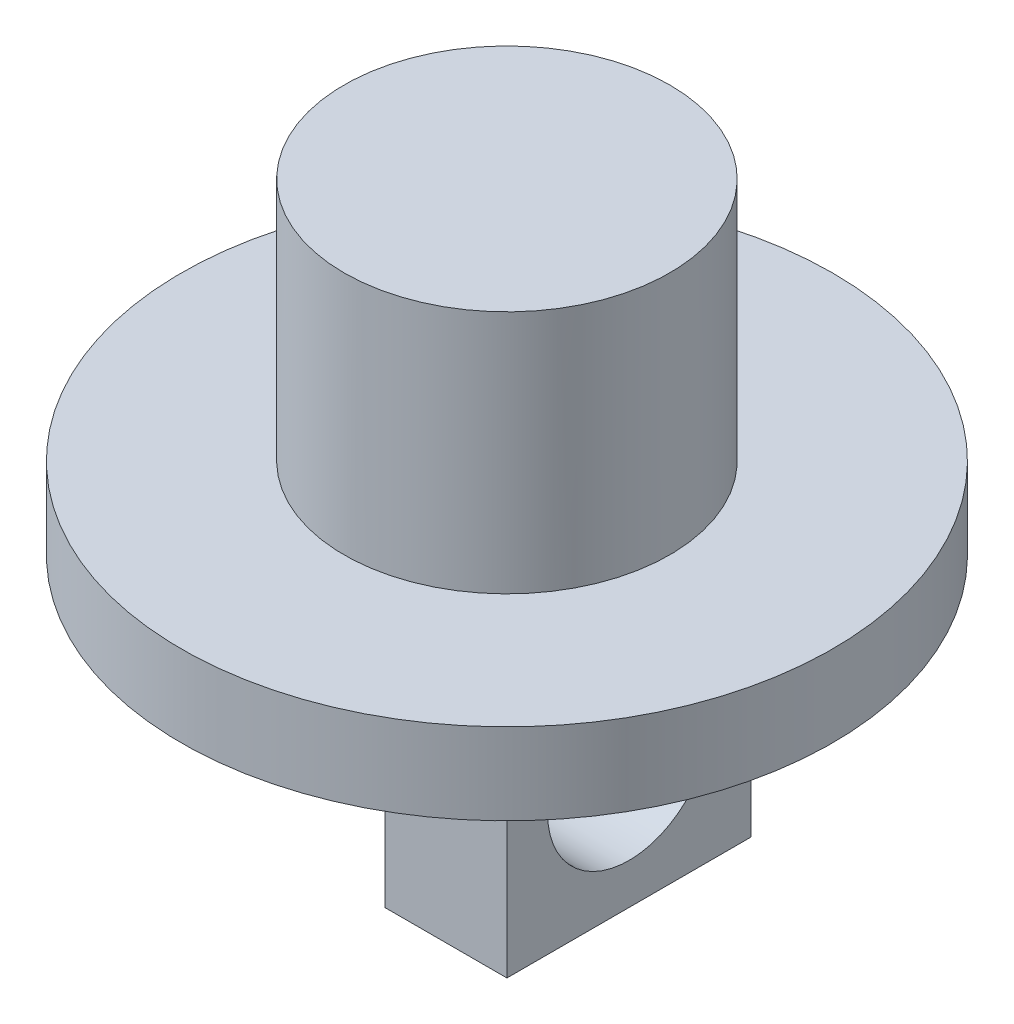
ISO-10303-21;
HEADER;
FILE_DESCRIPTION(('STEP AP214'),'2;1');
FILE_NAME('part.step','',(''),(''),'','','');
FILE_SCHEMA(('AUTOMOTIVE_DESIGN { 1 0 10303 214 1 1 1 1 }'));
ENDSEC;
DATA;
#1=APPLICATION_CONTEXT('core data for automotive mechanical design processes');
#2=APPLICATION_PROTOCOL_DEFINITION('international standard','automotive_design',2000,#1);
#3=PRODUCT_CONTEXT('',#1,'mechanical');
#4=PRODUCT('Part','Part','',(#3));
#5=PRODUCT_RELATED_PRODUCT_CATEGORY('part','',(#4));
#6=PRODUCT_DEFINITION_FORMATION('','',#4);
#7=PRODUCT_DEFINITION_CONTEXT('part definition',#1,'design');
#8=PRODUCT_DEFINITION('design','',#6,#7);
#9=PRODUCT_DEFINITION_SHAPE('','',#8);
#10=(LENGTH_UNIT() NAMED_UNIT(*) SI_UNIT(.MILLI.,.METRE.));
#11=(NAMED_UNIT(*) PLANE_ANGLE_UNIT() SI_UNIT($,.RADIAN.));
#12=(NAMED_UNIT(*) SI_UNIT($,.STERADIAN.) SOLID_ANGLE_UNIT());
#13=UNCERTAINTY_MEASURE_WITH_UNIT(LENGTH_MEASURE(1.E-05),#10,'distance_accuracy_value','');
#14=(GEOMETRIC_REPRESENTATION_CONTEXT(3) GLOBAL_UNCERTAINTY_ASSIGNED_CONTEXT((#13)) GLOBAL_UNIT_ASSIGNED_CONTEXT((#10,
#11,#12)) REPRESENTATION_CONTEXT('',''));
#15=CARTESIAN_POINT('',(0.,0.,0.));
#16=DIRECTION('',(0.,0.,1.));
#17=DIRECTION('',(1.,0.,0.));
#18=AXIS2_PLACEMENT_3D('',#15,#16,#17);
#19=CARTESIAN_POINT('',(0.,0.,0.));
#20=DIRECTION('',(0.,1.,0.));
#21=DIRECTION('',(0.,0.,1.));
#22=AXIS2_PLACEMENT_3D('',#19,#20,#21);
#23=PLANE('',#22);
#24=CARTESIAN_POINT('',(0.,0.,0.));
#25=DIRECTION('',(0.,-1.,0.));
#26=DIRECTION('',(0.,0.,-1.));
#27=AXIS2_PLACEMENT_3D('',#24,#25,#26);
#28=CIRCLE('',#27,5.08);
#29=CARTESIAN_POINT('',(0.,0.,-5.08));
#30=VERTEX_POINT('',#29);
#31=EDGE_CURVE('E104',#30,#30,#28,.T.);
#32=ORIENTED_EDGE('',*,*,#31,.T.);
#33=EDGE_LOOP('',(#32));
#34=FACE_BOUND('',#33,.T.);
#35=DIRECTION('',(0.,0.,-1.));
#36=VECTOR('',#35,1.);
#37=CARTESIAN_POINT('',(0.,0.,1.905));
#38=LINE('',#37,#36);
#39=CARTESIAN_POINT('',(0.,0.,1.905));
#40=VERTEX_POINT('',#39);
#41=CARTESIAN_POINT('',(0.,0.,-1.905));
#42=VERTEX_POINT('',#41);
#43=EDGE_CURVE('E55',#40,#42,#38,.T.);
#44=ORIENTED_EDGE('',*,*,#43,.F.);
#45=DIRECTION('',(-1.,0.,0.));
#46=VECTOR('',#45,1.);
#47=CARTESIAN_POINT('',(0.,0.,1.905));
#48=LINE('',#47,#46);
#49=CARTESIAN_POINT('',(1.905,0.,1.905));
#50=VERTEX_POINT('',#49);
#51=EDGE_CURVE('E59',#50,#40,#48,.T.);
#52=ORIENTED_EDGE('',*,*,#51,.F.);
#53=DIRECTION('',(0.,0.,1.));
#54=VECTOR('',#53,1.);
#55=CARTESIAN_POINT('',(1.905,0.,1.905));
#56=LINE('',#55,#54);
#57=CARTESIAN_POINT('',(1.905,0.,-1.905));
#58=VERTEX_POINT('',#57);
#59=EDGE_CURVE('E189',#58,#50,#56,.T.);
#60=ORIENTED_EDGE('',*,*,#59,.F.);
#61=DIRECTION('',(1.,0.,0.));
#62=VECTOR('',#61,1.);
#63=CARTESIAN_POINT('',(0.,0.,-1.905));
#64=LINE('',#63,#62);
#65=EDGE_CURVE('E178',#42,#58,#64,.T.);
#66=ORIENTED_EDGE('',*,*,#65,.F.);
#67=EDGE_LOOP('',(#44,#52,#60,#66));
#68=FACE_BOUND('',#67,.T.);
#69=ADVANCED_FACE('F39',(#34,#68),#23,.F.);
#70=CARTESIAN_POINT('',(0.,5.08,0.));
#71=DIRECTION('',(0.,-1.,0.));
#72=DIRECTION('',(0.,0.,-1.));
#73=AXIS2_PLACEMENT_3D('',#70,#71,#72);
#74=CYLINDRICAL_SURFACE('',#73,2.54);
#75=CARTESIAN_POINT('',(0.,5.08,0.));
#76=DIRECTION('',(0.,1.,0.));
#77=DIRECTION('',(0.,0.,1.));
#78=AXIS2_PLACEMENT_3D('',#75,#76,#77);
#79=CIRCLE('',#78,2.54);
#80=CARTESIAN_POINT('',(0.,5.08,2.54));
#81=VERTEX_POINT('',#80);
#82=EDGE_CURVE('E48',#81,#81,#79,.T.);
#83=ORIENTED_EDGE('',*,*,#82,.F.);
#84=EDGE_LOOP('',(#83));
#85=FACE_BOUND('',#84,.T.);
#86=CARTESIAN_POINT('',(0.,1.27,0.));
#87=DIRECTION('',(0.,-1.,0.));
#88=DIRECTION('',(0.,0.,-1.));
#89=AXIS2_PLACEMENT_3D('',#86,#87,#88);
#90=CIRCLE('',#89,2.54);
#91=CARTESIAN_POINT('',(0.,1.27,-2.54));
#92=VERTEX_POINT('',#91);
#93=EDGE_CURVE('E11',#92,#92,#90,.T.);
#94=ORIENTED_EDGE('',*,*,#93,.F.);
#95=EDGE_LOOP('',(#94));
#96=FACE_BOUND('',#95,.T.);
#97=ADVANCED_FACE('F41',(#85,#96),#74,.T.);
#98=CARTESIAN_POINT('',(0.,5.08,0.));
#99=DIRECTION('',(0.,1.,0.));
#100=DIRECTION('',(0.,0.,1.));
#101=AXIS2_PLACEMENT_3D('',#98,#99,#100);
#102=PLANE('',#101);
#103=ORIENTED_EDGE('',*,*,#82,.T.);
#104=EDGE_LOOP('',(#103));
#105=FACE_BOUND('',#104,.T.);
#106=ADVANCED_FACE('F121',(#105),#102,.T.);
#107=CARTESIAN_POINT('',(0.,1.27,0.));
#108=DIRECTION('',(0.,-1.,0.));
#109=DIRECTION('',(0.,0.,-1.));
#110=AXIS2_PLACEMENT_3D('',#107,#108,#109);
#111=CYLINDRICAL_SURFACE('',#110,5.08);
#112=CARTESIAN_POINT('',(0.,1.27,0.));
#113=DIRECTION('',(0.,-1.,0.));
#114=DIRECTION('',(0.,0.,-1.));
#115=AXIS2_PLACEMENT_3D('',#112,#113,#114);
#116=CIRCLE('',#115,5.08);
#117=CARTESIAN_POINT('',(0.,1.27,-5.08));
#118=VERTEX_POINT('',#117);
#119=EDGE_CURVE('E109',#118,#118,#116,.T.);
#120=ORIENTED_EDGE('',*,*,#119,.T.);
#121=EDGE_LOOP('',(#120));
#122=FACE_BOUND('',#121,.T.);
#123=ORIENTED_EDGE('',*,*,#31,.F.);
#124=EDGE_LOOP('',(#123));
#125=FACE_BOUND('',#124,.T.);
#126=ADVANCED_FACE('F130',(#122,#125),#111,.T.);
#127=CARTESIAN_POINT('',(0.,1.27,0.));
#128=DIRECTION('',(0.,-1.,0.));
#129=DIRECTION('',(0.,0.,-1.));
#130=AXIS2_PLACEMENT_3D('',#127,#128,#129);
#131=PLANE('',#130);
#132=ORIENTED_EDGE('',*,*,#93,.T.);
#133=EDGE_LOOP('',(#132));
#134=FACE_BOUND('',#133,.T.);
#135=ORIENTED_EDGE('',*,*,#119,.F.);
#136=EDGE_LOOP('',(#135));
#137=FACE_BOUND('',#136,.T.);
#138=ADVANCED_FACE('F127',(#134,#137),#131,.F.);
#139=CARTESIAN_POINT('',(0.,-3.81,1.905));
#140=DIRECTION('',(1.,0.,0.));
#141=DIRECTION('',(0.,0.,-1.));
#142=AXIS2_PLACEMENT_3D('',#139,#140,#141);
#143=PLANE('',#142);
#144=CARTESIAN_POINT('',(0.,-1.905,0.));
#145=DIRECTION('',(-1.,0.,0.));
#146=DIRECTION('',(0.,0.,1.));
#147=AXIS2_PLACEMENT_3D('',#144,#145,#146);
#148=CIRCLE('',#147,1.27);
#149=CARTESIAN_POINT('',(0.,-1.905,1.27));
#150=VERTEX_POINT('',#149);
#151=EDGE_CURVE('E170',#150,#150,#148,.T.);
#152=ORIENTED_EDGE('',*,*,#151,.F.);
#153=EDGE_LOOP('',(#152));
#154=FACE_BOUND('',#153,.T.);
#155=ORIENTED_EDGE('',*,*,#43,.T.);
#156=DIRECTION('',(0.,1.,0.));
#157=VECTOR('',#156,1.);
#158=CARTESIAN_POINT('',(0.,-3.81,-1.905));
#159=LINE('',#158,#157);
#160=CARTESIAN_POINT('',(0.,-3.81,-1.905));
#161=VERTEX_POINT('',#160);
#162=EDGE_CURVE('E84',#161,#42,#159,.T.);
#163=ORIENTED_EDGE('',*,*,#162,.F.);
#164=DIRECTION('',(0.,0.,-1.));
#165=VECTOR('',#164,1.);
#166=CARTESIAN_POINT('',(0.,-3.81,1.905));
#167=LINE('',#166,#165);
#168=CARTESIAN_POINT('',(0.,-3.81,1.905));
#169=VERTEX_POINT('',#168);
#170=EDGE_CURVE('E91',#169,#161,#167,.T.);
#171=ORIENTED_EDGE('',*,*,#170,.F.);
#172=DIRECTION('',(0.,1.,0.));
#173=VECTOR('',#172,1.);
#174=CARTESIAN_POINT('',(0.,-3.81,1.905));
#175=LINE('',#174,#173);
#176=EDGE_CURVE('E185',#169,#40,#175,.T.);
#177=ORIENTED_EDGE('',*,*,#176,.T.);
#178=EDGE_LOOP('',(#155,#163,#171,#177));
#179=FACE_BOUND('',#178,.T.);
#180=ADVANCED_FACE('F102',(#154,#179),#143,.F.);
#181=CARTESIAN_POINT('',(0.,-3.81,-1.905));
#182=DIRECTION('',(0.,0.,1.));
#183=DIRECTION('',(1.,0.,0.));
#184=AXIS2_PLACEMENT_3D('',#181,#182,#183);
#185=PLANE('',#184);
#186=ORIENTED_EDGE('',*,*,#65,.T.);
#187=DIRECTION('',(0.,1.,0.));
#188=VECTOR('',#187,1.);
#189=CARTESIAN_POINT('',(1.905,-3.81,-1.905));
#190=LINE('',#189,#188);
#191=CARTESIAN_POINT('',(1.905,-3.81,-1.905));
#192=VERTEX_POINT('',#191);
#193=EDGE_CURVE('E86',#192,#58,#190,.T.);
#194=ORIENTED_EDGE('',*,*,#193,.F.);
#195=DIRECTION('',(1.,0.,0.));
#196=VECTOR('',#195,1.);
#197=CARTESIAN_POINT('',(0.,-3.81,-1.905));
#198=LINE('',#197,#196);
#199=EDGE_CURVE('E79',#161,#192,#198,.T.);
#200=ORIENTED_EDGE('',*,*,#199,.F.);
#201=ORIENTED_EDGE('',*,*,#162,.T.);
#202=EDGE_LOOP('',(#186,#194,#200,#201));
#203=FACE_BOUND('',#202,.T.);
#204=ADVANCED_FACE('F82',(#203),#185,.F.);
#205=CARTESIAN_POINT('',(1.905,-3.81,1.905));
#206=DIRECTION('',(-1.,0.,0.));
#207=DIRECTION('',(0.,0.,1.));
#208=AXIS2_PLACEMENT_3D('',#205,#206,#207);
#209=PLANE('',#208);
#210=CARTESIAN_POINT('',(1.905,-1.905,0.));
#211=DIRECTION('',(-1.,0.,0.));
#212=DIRECTION('',(0.,0.,1.));
#213=AXIS2_PLACEMENT_3D('',#210,#211,#212);
#214=CIRCLE('',#213,1.27);
#215=CARTESIAN_POINT('',(1.905,-1.905,1.27));
#216=VERTEX_POINT('',#215);
#217=EDGE_CURVE('E173',#216,#216,#214,.F.);
#218=ORIENTED_EDGE('',*,*,#217,.F.);
#219=EDGE_LOOP('',(#218));
#220=FACE_BOUND('',#219,.T.);
#221=ORIENTED_EDGE('',*,*,#59,.T.);
#222=DIRECTION('',(0.,1.,0.));
#223=VECTOR('',#222,1.);
#224=CARTESIAN_POINT('',(1.905,-3.81,1.905));
#225=LINE('',#224,#223);
#226=CARTESIAN_POINT('',(1.905,-3.81,1.905));
#227=VERTEX_POINT('',#226);
#228=EDGE_CURVE('E111',#227,#50,#225,.T.);
#229=ORIENTED_EDGE('',*,*,#228,.F.);
#230=DIRECTION('',(0.,0.,1.));
#231=VECTOR('',#230,1.);
#232=CARTESIAN_POINT('',(1.905,-3.81,1.905));
#233=LINE('',#232,#231);
#234=EDGE_CURVE('E90',#192,#227,#233,.T.);
#235=ORIENTED_EDGE('',*,*,#234,.F.);
#236=ORIENTED_EDGE('',*,*,#193,.T.);
#237=EDGE_LOOP('',(#221,#229,#235,#236));
#238=FACE_BOUND('',#237,.T.);
#239=ADVANCED_FACE('F152',(#220,#238),#209,.F.);
#240=CARTESIAN_POINT('',(0.,-3.81,1.905));
#241=DIRECTION('',(0.,0.,-1.));
#242=DIRECTION('',(-1.,0.,0.));
#243=AXIS2_PLACEMENT_3D('',#240,#241,#242);
#244=PLANE('',#243);
#245=ORIENTED_EDGE('',*,*,#51,.T.);
#246=ORIENTED_EDGE('',*,*,#176,.F.);
#247=DIRECTION('',(-1.,0.,0.));
#248=VECTOR('',#247,1.);
#249=CARTESIAN_POINT('',(0.,-3.81,1.905));
#250=LINE('',#249,#248);
#251=EDGE_CURVE('E96',#227,#169,#250,.T.);
#252=ORIENTED_EDGE('',*,*,#251,.F.);
#253=ORIENTED_EDGE('',*,*,#228,.T.);
#254=EDGE_LOOP('',(#245,#246,#252,#253));
#255=FACE_BOUND('',#254,.T.);
#256=ADVANCED_FACE('F155',(#255),#244,.F.);
#257=CARTESIAN_POINT('',(0.,-3.81,0.));
#258=DIRECTION('',(0.,-1.,0.));
#259=DIRECTION('',(0.,0.,-1.));
#260=AXIS2_PLACEMENT_3D('',#257,#258,#259);
#261=PLANE('',#260);
#262=ORIENTED_EDGE('',*,*,#170,.T.);
#263=ORIENTED_EDGE('',*,*,#199,.T.);
#264=ORIENTED_EDGE('',*,*,#234,.T.);
#265=ORIENTED_EDGE('',*,*,#251,.T.);
#266=EDGE_LOOP('',(#262,#263,#264,#265));
#267=FACE_BOUND('',#266,.T.);
#268=ADVANCED_FACE('F94',(#267),#261,.T.);
#269=CARTESIAN_POINT('',(5.081,-1.905,0.));
#270=DIRECTION('',(-1.,0.,0.));
#271=DIRECTION('',(0.,0.,1.));
#272=AXIS2_PLACEMENT_3D('',#269,#270,#271);
#273=CYLINDRICAL_SURFACE('',#272,1.27);
#274=ORIENTED_EDGE('',*,*,#151,.T.);
#275=EDGE_LOOP('',(#274));
#276=FACE_BOUND('',#275,.T.);
#277=ORIENTED_EDGE('',*,*,#217,.T.);
#278=EDGE_LOOP('',(#277));
#279=FACE_BOUND('',#278,.T.);
#280=ADVANCED_FACE('F162',(#276,#279),#273,.F.);
#281=CLOSED_SHELL('',(#69,#97,#106,#126,#138,#180,#204,#239,#256,#268,#280));
#282=MANIFOLD_SOLID_BREP('B2',#281);
#283=ADVANCED_BREP_SHAPE_REPRESENTATION('',(#18,#282),#14);
#284=SHAPE_DEFINITION_REPRESENTATION(#9,#283);
ENDSEC;
END-ISO-10303-21;
